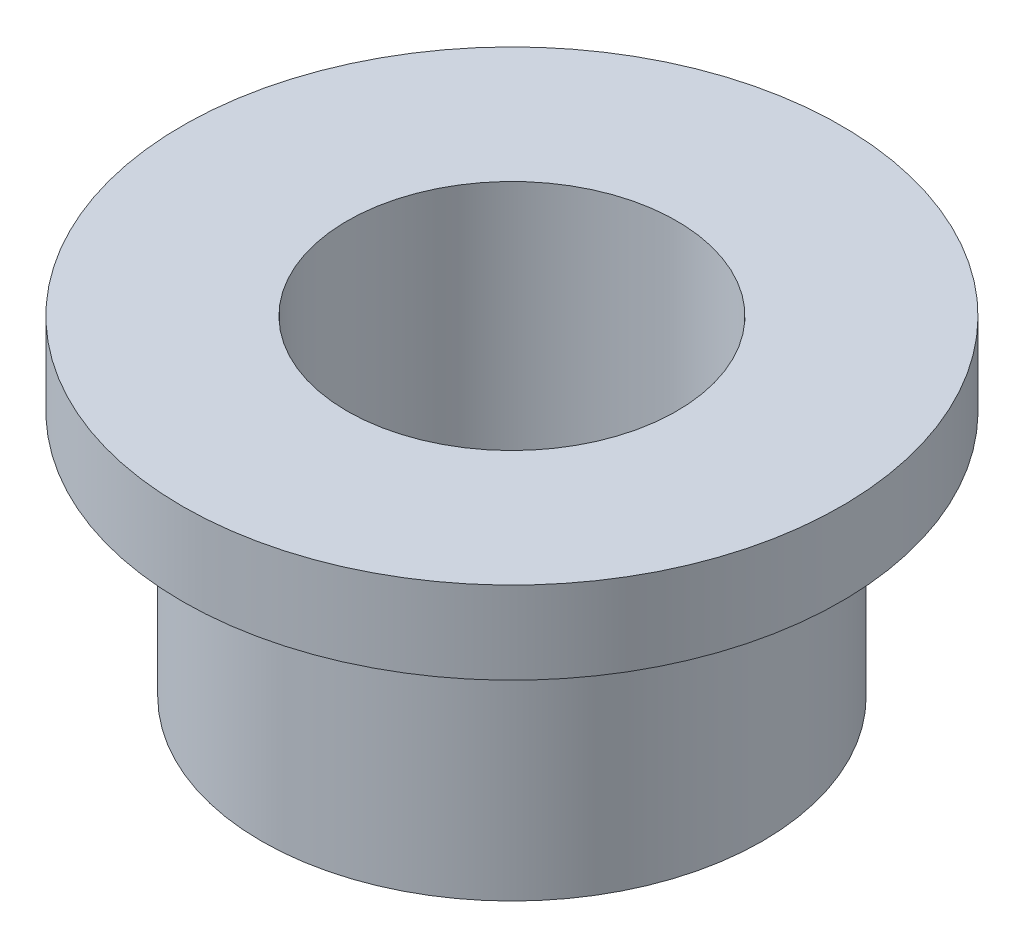
ISO-10303-21;
HEADER;
FILE_DESCRIPTION(('STEP AP214'),'2;1');
FILE_NAME('part.step','',(''),(''),'','','');
FILE_SCHEMA(('AUTOMOTIVE_DESIGN { 1 0 10303 214 1 1 1 1 }'));
ENDSEC;
DATA;
#1=APPLICATION_CONTEXT('core data for automotive mechanical design processes');
#2=APPLICATION_PROTOCOL_DEFINITION('international standard','automotive_design',2000,#1);
#3=PRODUCT_CONTEXT('',#1,'mechanical');
#4=PRODUCT('Part','Part','',(#3));
#5=PRODUCT_RELATED_PRODUCT_CATEGORY('part','',(#4));
#6=PRODUCT_DEFINITION_FORMATION('','',#4);
#7=PRODUCT_DEFINITION_CONTEXT('part definition',#1,'design');
#8=PRODUCT_DEFINITION('design','',#6,#7);
#9=PRODUCT_DEFINITION_SHAPE('','',#8);
#10=(LENGTH_UNIT() NAMED_UNIT(*) SI_UNIT(.MILLI.,.METRE.));
#11=(NAMED_UNIT(*) PLANE_ANGLE_UNIT() SI_UNIT($,.RADIAN.));
#12=(NAMED_UNIT(*) SI_UNIT($,.STERADIAN.) SOLID_ANGLE_UNIT());
#13=UNCERTAINTY_MEASURE_WITH_UNIT(LENGTH_MEASURE(1.E-05),#10,'distance_accuracy_value','');
#14=(GEOMETRIC_REPRESENTATION_CONTEXT(3) GLOBAL_UNCERTAINTY_ASSIGNED_CONTEXT((#13)) GLOBAL_UNIT_ASSIGNED_CONTEXT((#10,
#11,#12)) REPRESENTATION_CONTEXT('',''));
#15=CARTESIAN_POINT('',(0.,0.,0.));
#16=DIRECTION('',(0.,0.,1.));
#17=DIRECTION('',(1.,0.,0.));
#18=AXIS2_PLACEMENT_3D('',#15,#16,#17);
#19=CARTESIAN_POINT('',(0.,6.35,0.));
#20=DIRECTION('',(0.,-1.,0.));
#21=DIRECTION('',(0.,0.,-1.));
#22=AXIS2_PLACEMENT_3D('',#19,#20,#21);
#23=CYLINDRICAL_SURFACE('',#22,4.826);
#24=CARTESIAN_POINT('',(0.,0.,0.));
#25=DIRECTION('',(0.,1.,0.));
#26=DIRECTION('',(0.,0.,1.));
#27=AXIS2_PLACEMENT_3D('',#24,#25,#26);
#28=CIRCLE('',#27,4.826);
#29=CARTESIAN_POINT('',(0.,0.,4.826));
#30=VERTEX_POINT('',#29);
#31=EDGE_CURVE('E39',#30,#30,#28,.T.);
#32=ORIENTED_EDGE('',*,*,#31,.T.);
#33=EDGE_LOOP('',(#32));
#34=FACE_BOUND('',#33,.T.);
#35=CARTESIAN_POINT('',(0.,4.7625,0.));
#36=DIRECTION('',(0.,1.,0.));
#37=DIRECTION('',(0.,0.,1.));
#38=AXIS2_PLACEMENT_3D('',#35,#36,#37);
#39=CIRCLE('',#38,4.826);
#40=CARTESIAN_POINT('',(0.,4.7625,4.826));
#41=VERTEX_POINT('',#40);
#42=EDGE_CURVE('E10',#41,#41,#39,.T.);
#43=ORIENTED_EDGE('',*,*,#42,.F.);
#44=EDGE_LOOP('',(#43));
#45=FACE_BOUND('',#44,.T.);
#46=ADVANCED_FACE('F33',(#34,#45),#23,.T.);
#47=CARTESIAN_POINT('',(0.,6.35,0.));
#48=DIRECTION('',(0.,1.,0.));
#49=DIRECTION('',(0.,0.,1.));
#50=AXIS2_PLACEMENT_3D('',#47,#48,#49);
#51=PLANE('',#50);
#52=CARTESIAN_POINT('',(0.,6.35,0.));
#53=DIRECTION('',(0.,1.,0.));
#54=DIRECTION('',(0.,0.,1.));
#55=AXIS2_PLACEMENT_3D('',#52,#53,#54);
#56=CIRCLE('',#55,3.175);
#57=CARTESIAN_POINT('',(0.,6.35,3.175));
#58=VERTEX_POINT('',#57);
#59=EDGE_CURVE('E43',#58,#58,#56,.T.);
#60=ORIENTED_EDGE('',*,*,#59,.F.);
#61=EDGE_LOOP('',(#60));
#62=FACE_BOUND('',#61,.T.);
#63=CARTESIAN_POINT('',(0.,6.35,0.));
#64=DIRECTION('',(0.,1.,0.));
#65=DIRECTION('',(0.,0.,1.));
#66=AXIS2_PLACEMENT_3D('',#63,#64,#65);
#67=CIRCLE('',#66,6.35);
#68=CARTESIAN_POINT('',(0.,6.35,6.35));
#69=VERTEX_POINT('',#68);
#70=EDGE_CURVE('E53',#69,#69,#67,.T.);
#71=ORIENTED_EDGE('',*,*,#70,.T.);
#72=EDGE_LOOP('',(#71));
#73=FACE_BOUND('',#72,.T.);
#74=ADVANCED_FACE('F71',(#62,#73),#51,.T.);
#75=CARTESIAN_POINT('',(0.,0.,0.));
#76=DIRECTION('',(0.,1.,0.));
#77=DIRECTION('',(0.,0.,1.));
#78=AXIS2_PLACEMENT_3D('',#75,#76,#77);
#79=PLANE('',#78);
#80=ORIENTED_EDGE('',*,*,#31,.F.);
#81=EDGE_LOOP('',(#80));
#82=FACE_BOUND('',#81,.T.);
#83=CARTESIAN_POINT('',(0.,0.,0.));
#84=DIRECTION('',(0.,1.,0.));
#85=DIRECTION('',(0.,0.,1.));
#86=AXIS2_PLACEMENT_3D('',#83,#84,#85);
#87=CIRCLE('',#86,3.175);
#88=CARTESIAN_POINT('',(0.,0.,3.175));
#89=VERTEX_POINT('',#88);
#90=EDGE_CURVE('E47',#89,#89,#87,.T.);
#91=ORIENTED_EDGE('',*,*,#90,.T.);
#92=EDGE_LOOP('',(#91));
#93=FACE_BOUND('',#92,.T.);
#94=ADVANCED_FACE('F75',(#82,#93),#79,.F.);
#95=CARTESIAN_POINT('',(0.,6.35,0.));
#96=DIRECTION('',(0.,-1.,0.));
#97=DIRECTION('',(0.,0.,-1.));
#98=AXIS2_PLACEMENT_3D('',#95,#96,#97);
#99=CYLINDRICAL_SURFACE('',#98,3.175);
#100=ORIENTED_EDGE('',*,*,#59,.T.);
#101=EDGE_LOOP('',(#100));
#102=FACE_BOUND('',#101,.T.);
#103=ORIENTED_EDGE('',*,*,#90,.F.);
#104=EDGE_LOOP('',(#103));
#105=FACE_BOUND('',#104,.T.);
#106=ADVANCED_FACE('F68',(#102,#105),#99,.F.);
#107=CARTESIAN_POINT('',(0.,4.7625,0.));
#108=DIRECTION('',(0.,1.,0.));
#109=DIRECTION('',(0.,0.,1.));
#110=AXIS2_PLACEMENT_3D('',#107,#108,#109);
#111=CYLINDRICAL_SURFACE('',#110,6.35);
#112=CARTESIAN_POINT('',(0.,4.7625,0.));
#113=DIRECTION('',(0.,1.,0.));
#114=DIRECTION('',(0.,0.,1.));
#115=AXIS2_PLACEMENT_3D('',#112,#113,#114);
#116=CIRCLE('',#115,6.35);
#117=CARTESIAN_POINT('',(0.,4.7625,6.35));
#118=VERTEX_POINT('',#117);
#119=EDGE_CURVE('E51',#118,#118,#116,.T.);
#120=ORIENTED_EDGE('',*,*,#119,.T.);
#121=EDGE_LOOP('',(#120));
#122=FACE_BOUND('',#121,.T.);
#123=ORIENTED_EDGE('',*,*,#70,.F.);
#124=EDGE_LOOP('',(#123));
#125=FACE_BOUND('',#124,.T.);
#126=ADVANCED_FACE('F59',(#122,#125),#111,.T.);
#127=CARTESIAN_POINT('',(0.,4.7625,0.));
#128=DIRECTION('',(0.,1.,0.));
#129=DIRECTION('',(0.,0.,1.));
#130=AXIS2_PLACEMENT_3D('',#127,#128,#129);
#131=PLANE('',#130);
#132=ORIENTED_EDGE('',*,*,#42,.T.);
#133=EDGE_LOOP('',(#132));
#134=FACE_BOUND('',#133,.T.);
#135=ORIENTED_EDGE('',*,*,#119,.F.);
#136=EDGE_LOOP('',(#135));
#137=FACE_BOUND('',#136,.T.);
#138=ADVANCED_FACE('F62',(#134,#137),#131,.F.);
#139=CLOSED_SHELL('',(#46,#74,#94,#106,#126,#138));
#140=MANIFOLD_SOLID_BREP('B2',#139);
#141=ADVANCED_BREP_SHAPE_REPRESENTATION('',(#18,#140),#14);
#142=SHAPE_DEFINITION_REPRESENTATION(#9,#141);
ENDSEC;
END-ISO-10303-21;
